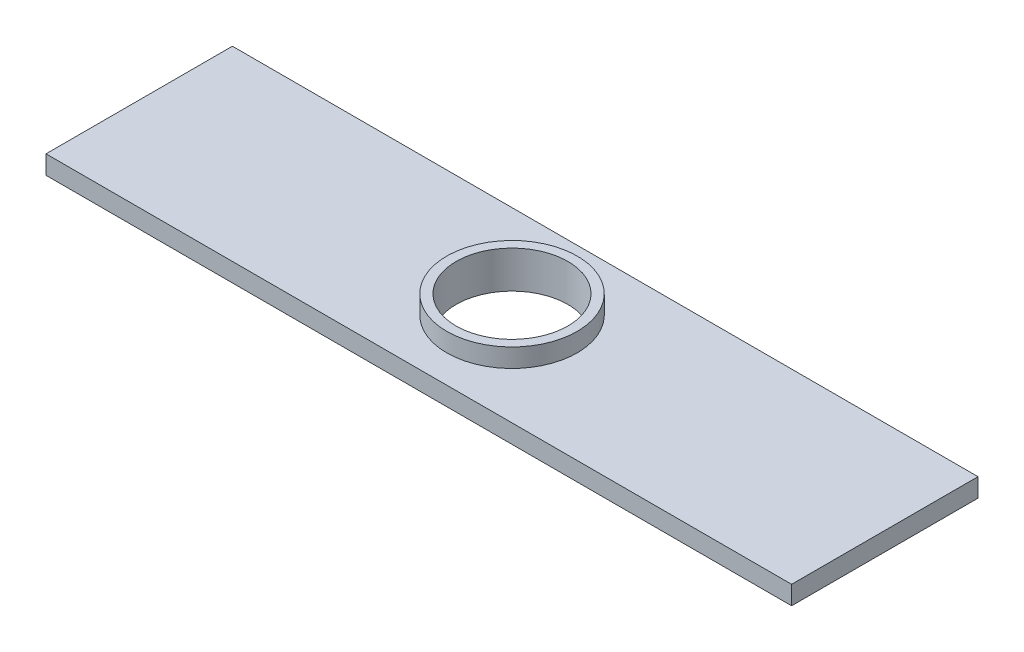
ISO-10303-21;
HEADER;
FILE_DESCRIPTION(('STEP AP214'),'2;1');
FILE_NAME('part.step','',(''),(''),'','','');
FILE_SCHEMA(('AUTOMOTIVE_DESIGN { 1 0 10303 214 1 1 1 1 }'));
ENDSEC;
DATA;
#1=APPLICATION_CONTEXT('core data for automotive mechanical design processes');
#2=APPLICATION_PROTOCOL_DEFINITION('international standard','automotive_design',2000,#1);
#3=PRODUCT_CONTEXT('',#1,'mechanical');
#4=PRODUCT('Part','Part','',(#3));
#5=PRODUCT_RELATED_PRODUCT_CATEGORY('part','',(#4));
#6=PRODUCT_DEFINITION_FORMATION('','',#4);
#7=PRODUCT_DEFINITION_CONTEXT('part definition',#1,'design');
#8=PRODUCT_DEFINITION('design','',#6,#7);
#9=PRODUCT_DEFINITION_SHAPE('','',#8);
#10=(LENGTH_UNIT() NAMED_UNIT(*) SI_UNIT(.MILLI.,.METRE.));
#11=(NAMED_UNIT(*) PLANE_ANGLE_UNIT() SI_UNIT($,.RADIAN.));
#12=(NAMED_UNIT(*) SI_UNIT($,.STERADIAN.) SOLID_ANGLE_UNIT());
#13=UNCERTAINTY_MEASURE_WITH_UNIT(LENGTH_MEASURE(1.E-05),#10,'distance_accuracy_value','');
#14=(GEOMETRIC_REPRESENTATION_CONTEXT(3) GLOBAL_UNCERTAINTY_ASSIGNED_CONTEXT((#13)) GLOBAL_UNIT_ASSIGNED_CONTEXT((#10,
#11,#12)) REPRESENTATION_CONTEXT('',''));
#15=CARTESIAN_POINT('',(0.,0.,0.));
#16=DIRECTION('',(0.,0.,1.));
#17=DIRECTION('',(1.,0.,0.));
#18=AXIS2_PLACEMENT_3D('',#15,#16,#17);
#19=CARTESIAN_POINT('',(0.,5.,0.));
#20=DIRECTION('',(0.,-1.,0.));
#21=DIRECTION('',(0.,0.,-1.));
#22=AXIS2_PLACEMENT_3D('',#19,#20,#21);
#23=CYLINDRICAL_SURFACE('',#22,15.);
#24=CARTESIAN_POINT('',(0.,5.,0.));
#25=DIRECTION('',(0.,1.,0.));
#26=DIRECTION('',(0.,0.,1.));
#27=AXIS2_PLACEMENT_3D('',#24,#25,#26);
#28=CIRCLE('',#27,15.);
#29=CARTESIAN_POINT('',(0.,5.,15.));
#30=VERTEX_POINT('',#29);
#31=EDGE_CURVE('E43',#30,#30,#28,.T.);
#32=ORIENTED_EDGE('',*,*,#31,.T.);
#33=EDGE_LOOP('',(#32));
#34=FACE_BOUND('',#33,.T.);
#35=CARTESIAN_POINT('',(0.,-5.,0.));
#36=DIRECTION('',(0.,1.,0.));
#37=DIRECTION('',(0.,0.,1.));
#38=AXIS2_PLACEMENT_3D('',#35,#36,#37);
#39=CIRCLE('',#38,15.);
#40=CARTESIAN_POINT('',(0.,-5.,15.));
#41=VERTEX_POINT('',#40);
#42=EDGE_CURVE('E104',#41,#41,#39,.T.);
#43=ORIENTED_EDGE('',*,*,#42,.F.);
#44=EDGE_LOOP('',(#43));
#45=FACE_BOUND('',#44,.T.);
#46=ADVANCED_FACE('F35',(#34,#45),#23,.F.);
#47=CARTESIAN_POINT('',(0.,5.,0.));
#48=DIRECTION('',(0.,-1.,0.));
#49=DIRECTION('',(0.,0.,-1.));
#50=AXIS2_PLACEMENT_3D('',#47,#48,#49);
#51=CYLINDRICAL_SURFACE('',#50,17.5);
#52=CARTESIAN_POINT('',(0.,5.,0.));
#53=DIRECTION('',(0.,1.,0.));
#54=DIRECTION('',(0.,0.,1.));
#55=AXIS2_PLACEMENT_3D('',#52,#53,#54);
#56=CIRCLE('',#55,17.5);
#57=CARTESIAN_POINT('',(0.,5.,17.5));
#58=VERTEX_POINT('',#57);
#59=EDGE_CURVE('E11',#58,#58,#56,.T.);
#60=ORIENTED_EDGE('',*,*,#59,.F.);
#61=EDGE_LOOP('',(#60));
#62=FACE_BOUND('',#61,.T.);
#63=CARTESIAN_POINT('',(0.,0.,0.));
#64=DIRECTION('',(0.,1.,0.));
#65=DIRECTION('',(0.,0.,1.));
#66=AXIS2_PLACEMENT_3D('',#63,#64,#65);
#67=CIRCLE('',#66,17.5);
#68=CARTESIAN_POINT('',(0.,0.,17.5));
#69=VERTEX_POINT('',#68);
#70=EDGE_CURVE('E115',#69,#69,#67,.T.);
#71=ORIENTED_EDGE('',*,*,#70,.T.);
#72=EDGE_LOOP('',(#71));
#73=FACE_BOUND('',#72,.T.);
#74=ADVANCED_FACE('F128',(#62,#73),#51,.T.);
#75=CARTESIAN_POINT('',(0.,5.,0.));
#76=DIRECTION('',(0.,1.,0.));
#77=DIRECTION('',(0.,0.,1.));
#78=AXIS2_PLACEMENT_3D('',#75,#76,#77);
#79=PLANE('',#78);
#80=ORIENTED_EDGE('',*,*,#31,.F.);
#81=EDGE_LOOP('',(#80));
#82=FACE_BOUND('',#81,.T.);
#83=ORIENTED_EDGE('',*,*,#59,.T.);
#84=EDGE_LOOP('',(#83));
#85=FACE_BOUND('',#84,.T.);
#86=ADVANCED_FACE('F124',(#82,#85),#79,.T.);
#87=CARTESIAN_POINT('',(0.,-5.,25.));
#88=DIRECTION('',(0.,0.,1.));
#89=DIRECTION('',(1.,0.,0.));
#90=AXIS2_PLACEMENT_3D('',#87,#88,#89);
#91=PLANE('',#90);
#92=DIRECTION('',(1.,0.,0.));
#93=VECTOR('',#92,1.);
#94=CARTESIAN_POINT('',(0.,0.,25.));
#95=LINE('',#94,#93);
#96=CARTESIAN_POINT('',(-100.,0.,25.));
#97=VERTEX_POINT('',#96);
#98=CARTESIAN_POINT('',(100.,0.,25.));
#99=VERTEX_POINT('',#98);
#100=EDGE_CURVE('E107',#97,#99,#95,.T.);
#101=ORIENTED_EDGE('',*,*,#100,.F.);
#102=DIRECTION('',(0.,1.,0.));
#103=VECTOR('',#102,1.);
#104=CARTESIAN_POINT('',(-100.,-5.,25.));
#105=LINE('',#104,#103);
#106=CARTESIAN_POINT('',(-100.,-5.,25.));
#107=VERTEX_POINT('',#106);
#108=EDGE_CURVE('E51',#107,#97,#105,.T.);
#109=ORIENTED_EDGE('',*,*,#108,.F.);
#110=DIRECTION('',(1.,0.,0.));
#111=VECTOR('',#110,1.);
#112=CARTESIAN_POINT('',(0.,-5.,25.));
#113=LINE('',#112,#111);
#114=CARTESIAN_POINT('',(100.,-5.,25.));
#115=VERTEX_POINT('',#114);
#116=EDGE_CURVE('E99',#107,#115,#113,.T.);
#117=ORIENTED_EDGE('',*,*,#116,.T.);
#118=DIRECTION('',(0.,1.,0.));
#119=VECTOR('',#118,1.);
#120=CARTESIAN_POINT('',(100.,-5.,25.));
#121=LINE('',#120,#119);
#122=EDGE_CURVE('E76',#115,#99,#121,.T.);
#123=ORIENTED_EDGE('',*,*,#122,.T.);
#124=EDGE_LOOP('',(#101,#109,#117,#123));
#125=FACE_BOUND('',#124,.T.);
#126=ADVANCED_FACE('F127',(#125),#91,.T.);
#127=CARTESIAN_POINT('',(-100.,-5.,0.));
#128=DIRECTION('',(1.,0.,0.));
#129=DIRECTION('',(0.,0.,-1.));
#130=AXIS2_PLACEMENT_3D('',#127,#128,#129);
#131=PLANE('',#130);
#132=DIRECTION('',(0.,0.,-1.));
#133=VECTOR('',#132,1.);
#134=CARTESIAN_POINT('',(-100.,0.,0.));
#135=LINE('',#134,#133);
#136=CARTESIAN_POINT('',(-100.,0.,-25.));
#137=VERTEX_POINT('',#136);
#138=EDGE_CURVE('E68',#97,#137,#135,.T.);
#139=ORIENTED_EDGE('',*,*,#138,.T.);
#140=DIRECTION('',(0.,1.,0.));
#141=VECTOR('',#140,1.);
#142=CARTESIAN_POINT('',(-100.,-5.,-25.));
#143=LINE('',#142,#141);
#144=CARTESIAN_POINT('',(-100.,-5.,-25.));
#145=VERTEX_POINT('',#144);
#146=EDGE_CURVE('E96',#145,#137,#143,.T.);
#147=ORIENTED_EDGE('',*,*,#146,.F.);
#148=DIRECTION('',(0.,0.,-1.));
#149=VECTOR('',#148,1.);
#150=CARTESIAN_POINT('',(-100.,-5.,0.));
#151=LINE('',#150,#149);
#152=EDGE_CURVE('E87',#107,#145,#151,.T.);
#153=ORIENTED_EDGE('',*,*,#152,.F.);
#154=ORIENTED_EDGE('',*,*,#108,.T.);
#155=EDGE_LOOP('',(#139,#147,#153,#154));
#156=FACE_BOUND('',#155,.T.);
#157=ADVANCED_FACE('F141',(#156),#131,.F.);
#158=CARTESIAN_POINT('',(0.,-5.,-25.));
#159=DIRECTION('',(0.,0.,1.));
#160=DIRECTION('',(1.,0.,0.));
#161=AXIS2_PLACEMENT_3D('',#158,#159,#160);
#162=PLANE('',#161);
#163=DIRECTION('',(1.,0.,0.));
#164=VECTOR('',#163,1.);
#165=CARTESIAN_POINT('',(0.,0.,-25.));
#166=LINE('',#165,#164);
#167=CARTESIAN_POINT('',(100.,0.,-25.));
#168=VERTEX_POINT('',#167);
#169=EDGE_CURVE('E94',#137,#168,#166,.T.);
#170=ORIENTED_EDGE('',*,*,#169,.T.);
#171=DIRECTION('',(0.,1.,0.));
#172=VECTOR('',#171,1.);
#173=CARTESIAN_POINT('',(100.,-5.,-25.));
#174=LINE('',#173,#172);
#175=CARTESIAN_POINT('',(100.,-5.,-25.));
#176=VERTEX_POINT('',#175);
#177=EDGE_CURVE('E91',#176,#168,#174,.T.);
#178=ORIENTED_EDGE('',*,*,#177,.F.);
#179=DIRECTION('',(1.,0.,0.));
#180=VECTOR('',#179,1.);
#181=CARTESIAN_POINT('',(0.,-5.,-25.));
#182=LINE('',#181,#180);
#183=EDGE_CURVE('E81',#145,#176,#182,.T.);
#184=ORIENTED_EDGE('',*,*,#183,.F.);
#185=ORIENTED_EDGE('',*,*,#146,.T.);
#186=EDGE_LOOP('',(#170,#178,#184,#185));
#187=FACE_BOUND('',#186,.T.);
#188=ADVANCED_FACE('F92',(#187),#162,.F.);
#189=CARTESIAN_POINT('',(100.,-5.,0.));
#190=DIRECTION('',(1.,0.,0.));
#191=DIRECTION('',(0.,0.,-1.));
#192=AXIS2_PLACEMENT_3D('',#189,#190,#191);
#193=PLANE('',#192);
#194=DIRECTION('',(0.,0.,-1.));
#195=VECTOR('',#194,1.);
#196=CARTESIAN_POINT('',(100.,0.,0.));
#197=LINE('',#196,#195);
#198=EDGE_CURVE('E110',#99,#168,#197,.T.);
#199=ORIENTED_EDGE('',*,*,#198,.F.);
#200=ORIENTED_EDGE('',*,*,#122,.F.);
#201=DIRECTION('',(0.,0.,-1.));
#202=VECTOR('',#201,1.);
#203=CARTESIAN_POINT('',(100.,-5.,0.));
#204=LINE('',#203,#202);
#205=EDGE_CURVE('E86',#115,#176,#204,.T.);
#206=ORIENTED_EDGE('',*,*,#205,.T.);
#207=ORIENTED_EDGE('',*,*,#177,.T.);
#208=EDGE_LOOP('',(#199,#200,#206,#207));
#209=FACE_BOUND('',#208,.T.);
#210=ADVANCED_FACE('F98',(#209),#193,.T.);
#211=CARTESIAN_POINT('',(0.,-5.,0.));
#212=DIRECTION('',(0.,1.,0.));
#213=DIRECTION('',(0.,0.,1.));
#214=AXIS2_PLACEMENT_3D('',#211,#212,#213);
#215=PLANE('',#214);
#216=ORIENTED_EDGE('',*,*,#116,.F.);
#217=ORIENTED_EDGE('',*,*,#152,.T.);
#218=ORIENTED_EDGE('',*,*,#183,.T.);
#219=ORIENTED_EDGE('',*,*,#205,.F.);
#220=EDGE_LOOP('',(#216,#217,#218,#219));
#221=FACE_BOUND('',#220,.T.);
#222=ORIENTED_EDGE('',*,*,#42,.T.);
#223=EDGE_LOOP('',(#222));
#224=FACE_BOUND('',#223,.T.);
#225=ADVANCED_FACE('F84',(#221,#224),#215,.F.);
#226=CARTESIAN_POINT('',(0.,0.,0.));
#227=DIRECTION('',(0.,1.,0.));
#228=DIRECTION('',(0.,0.,1.));
#229=AXIS2_PLACEMENT_3D('',#226,#227,#228);
#230=PLANE('',#229);
#231=ORIENTED_EDGE('',*,*,#70,.F.);
#232=EDGE_LOOP('',(#231));
#233=FACE_BOUND('',#232,.T.);
#234=ORIENTED_EDGE('',*,*,#100,.T.);
#235=ORIENTED_EDGE('',*,*,#198,.T.);
#236=ORIENTED_EDGE('',*,*,#169,.F.);
#237=ORIENTED_EDGE('',*,*,#138,.F.);
#238=EDGE_LOOP('',(#234,#235,#236,#237));
#239=FACE_BOUND('',#238,.T.);
#240=ADVANCED_FACE('F136',(#233,#239),#230,.T.);
#241=CLOSED_SHELL('',(#46,#74,#86,#126,#157,#188,#210,#225,#240));
#242=MANIFOLD_SOLID_BREP('B2',#241);
#243=ADVANCED_BREP_SHAPE_REPRESENTATION('',(#18,#242),#14);
#244=SHAPE_DEFINITION_REPRESENTATION(#9,#243);
ENDSEC;
END-ISO-10303-21;
